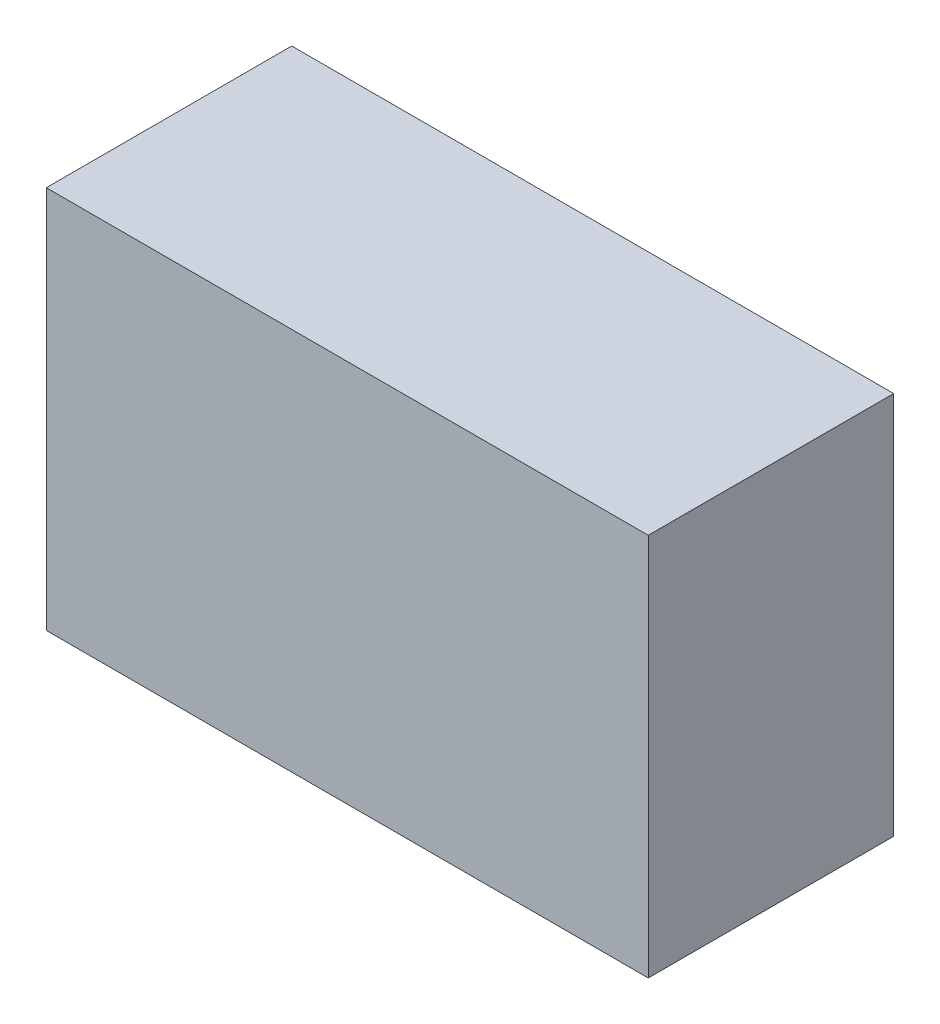
ISO-10303-21;
HEADER;
FILE_DESCRIPTION(('STEP AP214'),'2;1');
FILE_NAME('part.step','',(''),(''),'','','');
FILE_SCHEMA(('AUTOMOTIVE_DESIGN { 1 0 10303 214 1 1 1 1 }'));
ENDSEC;
DATA;
#1=APPLICATION_CONTEXT('core data for automotive mechanical design processes');
#2=APPLICATION_PROTOCOL_DEFINITION('international standard','automotive_design',2000,#1);
#3=PRODUCT_CONTEXT('',#1,'mechanical');
#4=PRODUCT('Part','Part','',(#3));
#5=PRODUCT_RELATED_PRODUCT_CATEGORY('part','',(#4));
#6=PRODUCT_DEFINITION_FORMATION('','',#4);
#7=PRODUCT_DEFINITION_CONTEXT('part definition',#1,'design');
#8=PRODUCT_DEFINITION('design','',#6,#7);
#9=PRODUCT_DEFINITION_SHAPE('','',#8);
#10=(LENGTH_UNIT() NAMED_UNIT(*) SI_UNIT(.MILLI.,.METRE.));
#11=(NAMED_UNIT(*) PLANE_ANGLE_UNIT() SI_UNIT($,.RADIAN.));
#12=(NAMED_UNIT(*) SI_UNIT($,.STERADIAN.) SOLID_ANGLE_UNIT());
#13=UNCERTAINTY_MEASURE_WITH_UNIT(LENGTH_MEASURE(1.E-05),#10,'distance_accuracy_value','');
#14=(GEOMETRIC_REPRESENTATION_CONTEXT(3) GLOBAL_UNCERTAINTY_ASSIGNED_CONTEXT((#13)) GLOBAL_UNIT_ASSIGNED_CONTEXT((#10,
#11,#12)) REPRESENTATION_CONTEXT('',''));
#15=CARTESIAN_POINT('',(0.,0.,0.));
#16=DIRECTION('',(0.,0.,1.));
#17=DIRECTION('',(1.,0.,0.));
#18=AXIS2_PLACEMENT_3D('',#15,#16,#17);
#19=CARTESIAN_POINT('',(0.,-19.8376419710467,6.35));
#20=DIRECTION('',(0.,1.,0.));
#21=DIRECTION('',(-1.,0.,0.));
#22=AXIS2_PLACEMENT_3D('',#19,#20,#21);
#23=PLANE('',#22);
#24=CARTESIAN_POINT('',(23.3612811681514,-19.8376419710467,0.));
#25=DIRECTION('',(0.,1.,0.));
#26=DIRECTION('',(-1.,0.,0.));
#27=AXIS2_PLACEMENT_3D('',#24,#25,#26);
#28=ELLIPSE('',#27,3.66617420935412,3.175);
#29=CARTESIAN_POINT('',(19.6951069587973,-19.8376419710467,0.));
#30=VERTEX_POINT('',#29);
#31=EDGE_CURVE('E11',#30,#30,#28,.T.);
#32=ORIENTED_EDGE('',*,*,#31,.T.);
#33=EDGE_LOOP('',(#32));
#34=FACE_BOUND('',#33,.T.);
#35=DIRECTION('',(1.,0.,0.));
#36=VECTOR('',#35,1.);
#37=CARTESIAN_POINT('',(0.,-19.8376419710467,-6.35));
#38=LINE('',#37,#36);
#39=CARTESIAN_POINT('',(0.,-19.8376419710467,-6.35));
#40=VERTEX_POINT('',#39);
#41=CARTESIAN_POINT('',(31.1483748908686,-19.8376419710467,-6.35));
#42=VERTEX_POINT('',#41);
#43=EDGE_CURVE('E110',#40,#42,#38,.T.);
#44=ORIENTED_EDGE('',*,*,#43,.T.);
#45=DIRECTION('',(0.,0.,-1.));
#46=VECTOR('',#45,1.);
#47=CARTESIAN_POINT('',(31.1483748908686,-19.8376419710467,6.35));
#48=LINE('',#47,#46);
#49=CARTESIAN_POINT('',(31.1483748908686,-19.8376419710467,6.35));
#50=VERTEX_POINT('',#49);
#51=EDGE_CURVE('E108',#50,#42,#48,.T.);
#52=ORIENTED_EDGE('',*,*,#51,.F.);
#53=DIRECTION('',(1.,0.,0.));
#54=VECTOR('',#53,1.);
#55=CARTESIAN_POINT('',(0.,-19.8376419710467,6.35));
#56=LINE('',#55,#54);
#57=CARTESIAN_POINT('',(0.,-19.8376419710467,6.35));
#58=VERTEX_POINT('',#57);
#59=EDGE_CURVE('E99',#58,#50,#56,.T.);
#60=ORIENTED_EDGE('',*,*,#59,.F.);
#61=DIRECTION('',(0.,0.,-1.));
#62=VECTOR('',#61,1.);
#63=CARTESIAN_POINT('',(0.,-19.8376419710467,6.35));
#64=LINE('',#63,#62);
#65=EDGE_CURVE('E112',#58,#40,#64,.T.);
#66=ORIENTED_EDGE('',*,*,#65,.T.);
#67=EDGE_LOOP('',(#44,#52,#60,#66));
#68=FACE_BOUND('',#67,.T.);
#69=CARTESIAN_POINT('',(7.78709372271712,-19.8376419710467,0.));
#70=DIRECTION('',(0.,1.,0.));
#71=DIRECTION('',(1.,0.,0.));
#72=AXIS2_PLACEMENT_3D('',#69,#70,#71);
#73=ELLIPSE('',#72,3.66617420935413,3.175);
#74=CARTESIAN_POINT('',(11.4532679320712,-19.8376419710467,0.));
#75=VERTEX_POINT('',#74);
#76=EDGE_CURVE('E54',#75,#75,#73,.F.);
#77=ORIENTED_EDGE('',*,*,#76,.F.);
#78=EDGE_LOOP('',(#77));
#79=FACE_BOUND('',#78,.T.);
#80=ADVANCED_FACE('F44',(#34,#68,#79),#23,.F.);
#81=CARTESIAN_POINT('',(0.,0.,6.35));
#82=DIRECTION('',(1.,0.,0.));
#83=DIRECTION('',(0.,1.,0.));
#84=AXIS2_PLACEMENT_3D('',#81,#82,#83);
#85=PLANE('',#84);
#86=CARTESIAN_POINT('',(0.,-6.35,0.));
#87=DIRECTION('',(-1.,0.,0.));
#88=DIRECTION('',(0.,-1.,0.));
#89=AXIS2_PLACEMENT_3D('',#86,#87,#88);
#90=CIRCLE('',#89,3.175);
#91=CARTESIAN_POINT('',(0.,-9.525,0.));
#92=VERTEX_POINT('',#91);
#93=EDGE_CURVE('E214',#92,#92,#90,.T.);
#94=ORIENTED_EDGE('',*,*,#93,.F.);
#95=EDGE_LOOP('',(#94));
#96=FACE_BOUND('',#95,.T.);
#97=DIRECTION('',(0.,-1.,0.));
#98=VECTOR('',#97,1.);
#99=CARTESIAN_POINT('',(0.,0.,-6.35));
#100=LINE('',#99,#98);
#101=CARTESIAN_POINT('',(0.,0.,-6.35));
#102=VERTEX_POINT('',#101);
#103=EDGE_CURVE('E124',#102,#40,#100,.T.);
#104=ORIENTED_EDGE('',*,*,#103,.T.);
#105=ORIENTED_EDGE('',*,*,#65,.F.);
#106=DIRECTION('',(0.,-1.,0.));
#107=VECTOR('',#106,1.);
#108=CARTESIAN_POINT('',(0.,0.,6.35));
#109=LINE('',#108,#107);
#110=CARTESIAN_POINT('',(0.,0.,6.35));
#111=VERTEX_POINT('',#110);
#112=EDGE_CURVE('E104',#111,#58,#109,.T.);
#113=ORIENTED_EDGE('',*,*,#112,.F.);
#114=DIRECTION('',(0.,0.,-1.));
#115=VECTOR('',#114,1.);
#116=CARTESIAN_POINT('',(0.,0.,6.35));
#117=LINE('',#116,#115);
#118=EDGE_CURVE('E120',#111,#102,#117,.T.);
#119=ORIENTED_EDGE('',*,*,#118,.T.);
#120=EDGE_LOOP('',(#104,#105,#113,#119));
#121=FACE_BOUND('',#120,.T.);
#122=ADVANCED_FACE('F46',(#96,#121),#85,.F.);
#123=CARTESIAN_POINT('',(31.1483748908686,0.,6.35));
#124=DIRECTION('',(-1.,0.,0.));
#125=DIRECTION('',(0.,-1.,0.));
#126=AXIS2_PLACEMENT_3D('',#123,#124,#125);
#127=PLANE('',#126);
#128=DIRECTION('',(0.,1.,0.));
#129=VECTOR('',#128,1.);
#130=CARTESIAN_POINT('',(31.1483748908686,0.,-6.35));
#131=LINE('',#130,#129);
#132=CARTESIAN_POINT('',(31.1483748908686,0.,-6.35));
#133=VERTEX_POINT('',#132);
#134=EDGE_CURVE('E84',#42,#133,#131,.T.);
#135=ORIENTED_EDGE('',*,*,#134,.T.);
#136=DIRECTION('',(0.,0.,-1.));
#137=VECTOR('',#136,1.);
#138=CARTESIAN_POINT('',(31.1483748908686,0.,6.35));
#139=LINE('',#138,#137);
#140=CARTESIAN_POINT('',(31.1483748908686,0.,6.35));
#141=VERTEX_POINT('',#140);
#142=EDGE_CURVE('E113',#141,#133,#139,.T.);
#143=ORIENTED_EDGE('',*,*,#142,.F.);
#144=DIRECTION('',(0.,1.,0.));
#145=VECTOR('',#144,1.);
#146=CARTESIAN_POINT('',(31.1483748908686,0.,6.35));
#147=LINE('',#146,#145);
#148=EDGE_CURVE('E102',#50,#141,#147,.T.);
#149=ORIENTED_EDGE('',*,*,#148,.F.);
#150=ORIENTED_EDGE('',*,*,#51,.T.);
#151=EDGE_LOOP('',(#135,#143,#149,#150));
#152=FACE_BOUND('',#151,.T.);
#153=ADVANCED_FACE('F115',(#152),#127,.F.);
#154=CARTESIAN_POINT('',(0.,0.,6.35));
#155=DIRECTION('',(0.,-1.,0.));
#156=DIRECTION('',(1.,0.,0.));
#157=AXIS2_PLACEMENT_3D('',#154,#155,#156);
#158=PLANE('',#157);
#159=DIRECTION('',(-1.,0.,0.));
#160=VECTOR('',#159,1.);
#161=CARTESIAN_POINT('',(0.,0.,-6.35));
#162=LINE('',#161,#160);
#163=EDGE_CURVE('E90',#133,#102,#162,.T.);
#164=ORIENTED_EDGE('',*,*,#163,.T.);
#165=ORIENTED_EDGE('',*,*,#118,.F.);
#166=DIRECTION('',(-1.,0.,0.));
#167=VECTOR('',#166,1.);
#168=CARTESIAN_POINT('',(0.,0.,6.35));
#169=LINE('',#168,#167);
#170=EDGE_CURVE('E64',#141,#111,#169,.T.);
#171=ORIENTED_EDGE('',*,*,#170,.F.);
#172=ORIENTED_EDGE('',*,*,#142,.T.);
#173=EDGE_LOOP('',(#164,#165,#171,#172));
#174=FACE_BOUND('',#173,.T.);
#175=ADVANCED_FACE('F154',(#174),#158,.F.);
#176=CARTESIAN_POINT('',(0.,0.,6.35));
#177=DIRECTION('',(0.,0.,1.));
#178=DIRECTION('',(1.,0.,0.));
#179=AXIS2_PLACEMENT_3D('',#176,#177,#178);
#180=PLANE('',#179);
#181=ORIENTED_EDGE('',*,*,#112,.T.);
#182=ORIENTED_EDGE('',*,*,#59,.T.);
#183=ORIENTED_EDGE('',*,*,#148,.T.);
#184=ORIENTED_EDGE('',*,*,#170,.T.);
#185=EDGE_LOOP('',(#181,#182,#183,#184));
#186=FACE_BOUND('',#185,.T.);
#187=ADVANCED_FACE('F100',(#186),#180,.T.);
#188=CARTESIAN_POINT('',(0.,0.,-6.35));
#189=DIRECTION('',(0.,0.,1.));
#190=DIRECTION('',(1.,0.,0.));
#191=AXIS2_PLACEMENT_3D('',#188,#189,#190);
#192=PLANE('',#191);
#193=CARTESIAN_POINT('',(15.5741874454343,-6.35,-6.35));
#194=DIRECTION('',(0.,0.,-1.));
#195=DIRECTION('',(-1.,0.,0.));
#196=AXIS2_PLACEMENT_3D('',#193,#194,#195);
#197=CIRCLE('',#196,3.175);
#198=CARTESIAN_POINT('',(12.3991874454343,-6.35,-6.35));
#199=VERTEX_POINT('',#198);
#200=EDGE_CURVE('E199',#199,#199,#197,.T.);
#201=ORIENTED_EDGE('',*,*,#200,.F.);
#202=EDGE_LOOP('',(#201));
#203=FACE_BOUND('',#202,.T.);
#204=ORIENTED_EDGE('',*,*,#103,.F.);
#205=ORIENTED_EDGE('',*,*,#163,.F.);
#206=ORIENTED_EDGE('',*,*,#134,.F.);
#207=ORIENTED_EDGE('',*,*,#43,.F.);
#208=EDGE_LOOP('',(#204,#205,#206,#207));
#209=FACE_BOUND('',#208,.T.);
#210=ADVANCED_FACE('F157',(#203,#209),#192,.F.);
#211=CARTESIAN_POINT('',(9.525,-6.35,0.));
#212=DIRECTION('',(-1.,0.,0.));
#213=DIRECTION('',(0.,-1.,0.));
#214=AXIS2_PLACEMENT_3D('',#211,#212,#213);
#215=CYLINDRICAL_SURFACE('',#214,3.175);
#216=CARTESIAN_POINT('',(9.525,-6.35,0.));
#217=DIRECTION('',(-1.,0.,0.));
#218=DIRECTION('',(0.,-1.,0.));
#219=AXIS2_PLACEMENT_3D('',#216,#217,#218);
#220=CIRCLE('',#219,3.175);
#221=CARTESIAN_POINT('',(9.525,-9.525,0.));
#222=VERTEX_POINT('',#221);
#223=EDGE_CURVE('E128',#222,#222,#220,.T.);
#224=CARTESIAN_POINT('',(9.525,-9.525,0.));
#225=CARTESIAN_POINT('',(9.42578125,-9.525,0.));
#226=CARTESIAN_POINT('',(9.3265625,-9.525,0.));
#227=CARTESIAN_POINT('',(9.128125,-9.525,0.));
#228=CARTESIAN_POINT('',(9.02890625,-9.525,0.));
#229=CARTESIAN_POINT('',(8.83046875,-9.525,0.));
#230=CARTESIAN_POINT('',(8.73125,-9.525,0.));
#231=CARTESIAN_POINT('',(8.5328125,-9.525,0.));
#232=CARTESIAN_POINT('',(8.43359375,-9.525,0.));
#233=CARTESIAN_POINT('',(8.23515625,-9.525,0.));
#234=CARTESIAN_POINT('',(8.1359375,-9.525,0.));
#235=CARTESIAN_POINT('',(7.9375,-9.525,0.));
#236=CARTESIAN_POINT('',(7.83828125,-9.525,0.));
#237=CARTESIAN_POINT('',(7.63984375,-9.525,0.));
#238=CARTESIAN_POINT('',(7.540625,-9.525,0.));
#239=CARTESIAN_POINT('',(7.3421875,-9.525,0.));
#240=CARTESIAN_POINT('',(7.24296875,-9.525,0.));
#241=CARTESIAN_POINT('',(7.04453125,-9.525,0.));
#242=CARTESIAN_POINT('',(6.9453125,-9.525,0.));
#243=CARTESIAN_POINT('',(6.746875,-9.525,0.));
#244=CARTESIAN_POINT('',(6.64765625,-9.525,0.));
#245=CARTESIAN_POINT('',(6.44921875,-9.525,0.));
#246=CARTESIAN_POINT('',(6.35,-9.525,0.));
#247=CARTESIAN_POINT('',(6.1515625,-9.525,0.));
#248=CARTESIAN_POINT('',(6.05234375,-9.525,0.));
#249=CARTESIAN_POINT('',(5.85390625,-9.525,0.));
#250=CARTESIAN_POINT('',(5.7546875,-9.525,0.));
#251=CARTESIAN_POINT('',(5.55625,-9.525,0.));
#252=CARTESIAN_POINT('',(5.45703125,-9.525,0.));
#253=CARTESIAN_POINT('',(5.25859375,-9.525,0.));
#254=CARTESIAN_POINT('',(5.159375,-9.525,0.));
#255=CARTESIAN_POINT('',(4.9609375,-9.525,0.));
#256=CARTESIAN_POINT('',(4.86171875,-9.525,0.));
#257=CARTESIAN_POINT('',(4.66328125,-9.525,0.));
#258=CARTESIAN_POINT('',(4.5640625,-9.525,0.));
#259=CARTESIAN_POINT('',(4.365625,-9.525,0.));
#260=CARTESIAN_POINT('',(4.26640625,-9.525,0.));
#261=CARTESIAN_POINT('',(4.06796875,-9.525,0.));
#262=CARTESIAN_POINT('',(3.96875,-9.525,0.));
#263=CARTESIAN_POINT('',(3.7703125,-9.525,0.));
#264=CARTESIAN_POINT('',(3.67109375,-9.525,0.));
#265=CARTESIAN_POINT('',(3.47265625,-9.525,0.));
#266=CARTESIAN_POINT('',(3.3734375,-9.525,0.));
#267=CARTESIAN_POINT('',(3.175,-9.525,0.));
#268=CARTESIAN_POINT('',(3.07578125,-9.525,0.));
#269=CARTESIAN_POINT('',(2.87734375,-9.525,0.));
#270=CARTESIAN_POINT('',(2.778125,-9.525,0.));
#271=CARTESIAN_POINT('',(2.5796875,-9.525,0.));
#272=CARTESIAN_POINT('',(2.48046875,-9.525,0.));
#273=CARTESIAN_POINT('',(2.28203125,-9.525,0.));
#274=CARTESIAN_POINT('',(2.1828125,-9.525,0.));
#275=CARTESIAN_POINT('',(1.984375,-9.525,0.));
#276=CARTESIAN_POINT('',(1.88515625,-9.525,0.));
#277=CARTESIAN_POINT('',(1.68671875,-9.525,0.));
#278=CARTESIAN_POINT('',(1.5875,-9.525,0.));
#279=CARTESIAN_POINT('',(1.3890625,-9.525,0.));
#280=CARTESIAN_POINT('',(1.28984375,-9.525,0.));
#281=CARTESIAN_POINT('',(1.09140625,-9.525,0.));
#282=CARTESIAN_POINT('',(0.992187500000001,-9.525,0.));
#283=CARTESIAN_POINT('',(0.793750000000001,-9.525,0.));
#284=CARTESIAN_POINT('',(0.69453125,-9.525,0.));
#285=CARTESIAN_POINT('',(0.49609375,-9.525,0.));
#286=CARTESIAN_POINT('',(0.396875,-9.525,0.));
#287=CARTESIAN_POINT('',(0.1984375,-9.525,0.));
#288=CARTESIAN_POINT('',(0.0992187500000001,-9.525,0.));
#289=CARTESIAN_POINT('',(0.,-9.525,0.));
#290=B_SPLINE_CURVE_WITH_KNOTS('',3,(#224,#225,#226,#227,#228,#229,#230,#231,#232,#233,#234,
#235,#236,#237,#238,#239,#240,#241,#242,#243,#244,#245,#246,#247,#248,#249,#250,#251,#252,#253,
#254,#255,#256,#257,#258,#259,#260,#261,#262,#263,#264,#265,#266,#267,#268,#269,#270,#271,#272,
#273,#274,#275,#276,#277,#278,#279,#280,#281,#282,#283,#284,#285,#286,#287,#288,#289),
.UNSPECIFIED.,.F.,.F.,(4,2,2,2,2,2,2,2,2,2,2,2,2,2,2,2,2,2,2,2,2,2,2,2,2,2,2,2,2,2,2,2,4),(0.,
0.297656249999998,0.595312499999999,0.892968749999999,1.190625,1.48828125,1.7859375,2.08359375,
2.38125,2.67890625,2.9765625,3.27421875,3.571875,3.86953125,4.1671875,4.46484375,4.7625,
5.06015625,5.3578125,5.65546875,5.953125,6.25078125,6.5484375,6.84609375,7.14375,7.44140625,
7.7390625,8.03671875,8.334375,8.63203125,8.9296875,9.22734375,9.525),.UNSPECIFIED.);
#291=EDGE_CURVE('BSEAM160',#222,#92,#290,.T.);
#292=ORIENTED_EDGE('',*,*,#223,.F.);
#293=ORIENTED_EDGE('',*,*,#93,.T.);
#294=ORIENTED_EDGE('',*,*,#291,.T.);
#295=ORIENTED_EDGE('',*,*,#291,.F.);
#296=EDGE_LOOP('',(#292,#294,#293,#295));
#297=FACE_BOUND('',#296,.T.);
#298=ADVANCED_FACE('F160',(#297),#215,.F.);
#299=CARTESIAN_POINT('',(9.525,-6.35,0.));
#300=DIRECTION('',(-1.,0.,0.));
#301=DIRECTION('',(0.,-1.,0.));
#302=AXIS2_PLACEMENT_3D('',#299,#300,#301);
#303=PLANE('',#302);
#304=ORIENTED_EDGE('',*,*,#223,.T.);
#305=EDGE_LOOP('',(#304));
#306=FACE_BOUND('',#305,.T.);
#307=ADVANCED_FACE('F166',(#306),#303,.T.);
#308=CARTESIAN_POINT('',(5.83963727933594,-23.2107354765103,0.));
#309=DIRECTION('',(0.500000000000001,0.866025403784438,0.));
#310=DIRECTION('',(-0.866025403784438,0.500000000000001,0.));
#311=AXIS2_PLACEMENT_3D('',#308,#309,#310);
#312=CYLINDRICAL_SURFACE('',#311,3.175);
#313=CARTESIAN_POINT('',(12.5495937227171,-11.58875,0.));
#314=DIRECTION('',(-0.500000000000001,-0.866025403784438,0.));
#315=DIRECTION('',(0.866025403784438,-0.500000000000001,0.));
#316=AXIS2_PLACEMENT_3D('',#313,#314,#315);
#317=CIRCLE('',#316,3.175);
#318=CARTESIAN_POINT('',(15.2992243797327,-13.17625,0.));
#319=VERTEX_POINT('',#318);
#320=EDGE_CURVE('E209',#319,#319,#317,.T.);
#321=ORIENTED_EDGE('',*,*,#320,.F.);
#322=EDGE_LOOP('',(#321));
#323=FACE_BOUND('',#322,.T.);
#324=ORIENTED_EDGE('',*,*,#76,.T.);
#325=EDGE_LOOP('',(#324));
#326=FACE_BOUND('',#325,.T.);
#327=ADVANCED_FACE('F144',(#323,#326),#312,.F.);
#328=CARTESIAN_POINT('',(12.5495937227171,-11.58875,0.));
#329=DIRECTION('',(-0.500000000000001,-0.866025403784438,0.));
#330=DIRECTION('',(0.866025403784438,-0.500000000000001,0.));
#331=AXIS2_PLACEMENT_3D('',#328,#329,#330);
#332=PLANE('',#331);
#333=ORIENTED_EDGE('',*,*,#320,.T.);
#334=EDGE_LOOP('',(#333));
#335=FACE_BOUND('',#334,.T.);
#336=ADVANCED_FACE('F173',(#335),#332,.T.);
#337=CARTESIAN_POINT('',(15.5741874454343,-6.35,3.175));
#338=DIRECTION('',(0.,0.,-1.));
#339=DIRECTION('',(-1.,0.,0.));
#340=AXIS2_PLACEMENT_3D('',#337,#338,#339);
#341=CYLINDRICAL_SURFACE('',#340,3.175);
#342=CARTESIAN_POINT('',(15.5741874454343,-6.35,3.175));
#343=DIRECTION('',(0.,0.,-1.));
#344=DIRECTION('',(-1.,0.,0.));
#345=AXIS2_PLACEMENT_3D('',#342,#343,#344);
#346=CIRCLE('',#345,3.175);
#347=CARTESIAN_POINT('',(12.3991874454343,-6.35,3.175));
#348=VERTEX_POINT('',#347);
#349=EDGE_CURVE('E204',#348,#348,#346,.T.);
#350=CARTESIAN_POINT('',(12.3991874454343,-6.35,3.175));
#351=CARTESIAN_POINT('',(12.3991874454343,-6.35,3.07578125));
#352=CARTESIAN_POINT('',(12.3991874454343,-6.35,2.9765625));
#353=CARTESIAN_POINT('',(12.3991874454343,-6.35,2.778125));
#354=CARTESIAN_POINT('',(12.3991874454343,-6.35,2.67890625));
#355=CARTESIAN_POINT('',(12.3991874454343,-6.35,2.48046875));
#356=CARTESIAN_POINT('',(12.3991874454343,-6.35,2.38125));
#357=CARTESIAN_POINT('',(12.3991874454343,-6.35,2.1828125));
#358=CARTESIAN_POINT('',(12.3991874454343,-6.35,2.08359375));
#359=CARTESIAN_POINT('',(12.3991874454343,-6.35,1.88515625));
#360=CARTESIAN_POINT('',(12.3991874454343,-6.35,1.7859375));
#361=CARTESIAN_POINT('',(12.3991874454343,-6.35,1.5875));
#362=CARTESIAN_POINT('',(12.3991874454343,-6.35,1.48828125));
#363=CARTESIAN_POINT('',(12.3991874454343,-6.35,1.28984375));
#364=CARTESIAN_POINT('',(12.3991874454343,-6.35,1.190625));
#365=CARTESIAN_POINT('',(12.3991874454343,-6.35,0.992187500000001));
#366=CARTESIAN_POINT('',(12.3991874454343,-6.35,0.892968750000001));
#367=CARTESIAN_POINT('',(12.3991874454343,-6.35,0.694531250000001));
#368=CARTESIAN_POINT('',(12.3991874454343,-6.35,0.5953125));
#369=CARTESIAN_POINT('',(12.3991874454343,-6.35,0.396875));
#370=CARTESIAN_POINT('',(12.3991874454343,-6.35,0.29765625));
#371=CARTESIAN_POINT('',(12.3991874454343,-6.35,0.0992187500000004));
#372=CARTESIAN_POINT('',(12.3991874454343,-6.35,0.));
#373=CARTESIAN_POINT('',(12.3991874454343,-6.35,-0.1984375));
#374=CARTESIAN_POINT('',(12.3991874454343,-6.35,-0.29765625));
#375=CARTESIAN_POINT('',(12.3991874454343,-6.35,-0.49609375));
#376=CARTESIAN_POINT('',(12.3991874454343,-6.35,-0.5953125));
#377=CARTESIAN_POINT('',(12.3991874454343,-6.35,-0.79375));
#378=CARTESIAN_POINT('',(12.3991874454343,-6.35,-0.892968749999999));
#379=CARTESIAN_POINT('',(12.3991874454343,-6.35,-1.09140625));
#380=CARTESIAN_POINT('',(12.3991874454343,-6.35,-1.190625));
#381=CARTESIAN_POINT('',(12.3991874454343,-6.35,-1.3890625));
#382=CARTESIAN_POINT('',(12.3991874454343,-6.35,-1.48828125));
#383=CARTESIAN_POINT('',(12.3991874454343,-6.35,-1.68671875));
#384=CARTESIAN_POINT('',(12.3991874454343,-6.35,-1.7859375));
#385=CARTESIAN_POINT('',(12.3991874454343,-6.35,-1.984375));
#386=CARTESIAN_POINT('',(12.3991874454343,-6.35,-2.08359375));
#387=CARTESIAN_POINT('',(12.3991874454343,-6.35,-2.28203125));
#388=CARTESIAN_POINT('',(12.3991874454343,-6.35,-2.38125));
#389=CARTESIAN_POINT('',(12.3991874454343,-6.35,-2.5796875));
#390=CARTESIAN_POINT('',(12.3991874454343,-6.35,-2.67890625));
#391=CARTESIAN_POINT('',(12.3991874454343,-6.35,-2.87734375));
#392=CARTESIAN_POINT('',(12.3991874454343,-6.35,-2.9765625));
#393=CARTESIAN_POINT('',(12.3991874454343,-6.35,-3.175));
#394=CARTESIAN_POINT('',(12.3991874454343,-6.35,-3.27421875));
#395=CARTESIAN_POINT('',(12.3991874454343,-6.35,-3.47265625));
#396=CARTESIAN_POINT('',(12.3991874454343,-6.35,-3.571875));
#397=CARTESIAN_POINT('',(12.3991874454343,-6.35,-3.7703125));
#398=CARTESIAN_POINT('',(12.3991874454343,-6.35,-3.86953125));
#399=CARTESIAN_POINT('',(12.3991874454343,-6.35,-4.06796875));
#400=CARTESIAN_POINT('',(12.3991874454343,-6.35,-4.1671875));
#401=CARTESIAN_POINT('',(12.3991874454343,-6.35,-4.365625));
#402=CARTESIAN_POINT('',(12.3991874454343,-6.35,-4.46484375));
#403=CARTESIAN_POINT('',(12.3991874454343,-6.35,-4.66328125));
#404=CARTESIAN_POINT('',(12.3991874454343,-6.35,-4.7625));
#405=CARTESIAN_POINT('',(12.3991874454343,-6.35,-4.9609375));
#406=CARTESIAN_POINT('',(12.3991874454343,-6.35,-5.06015625));
#407=CARTESIAN_POINT('',(12.3991874454343,-6.35,-5.25859375));
#408=CARTESIAN_POINT('',(12.3991874454343,-6.35,-5.3578125));
#409=CARTESIAN_POINT('',(12.3991874454343,-6.35,-5.55625));
#410=CARTESIAN_POINT('',(12.3991874454343,-6.35,-5.65546875));
#411=CARTESIAN_POINT('',(12.3991874454343,-6.35,-5.85390625));
#412=CARTESIAN_POINT('',(12.3991874454343,-6.35,-5.953125));
#413=CARTESIAN_POINT('',(12.3991874454343,-6.35,-6.1515625));
#414=CARTESIAN_POINT('',(12.3991874454343,-6.35,-6.25078125));
#415=CARTESIAN_POINT('',(12.3991874454343,-6.35,-6.35));
#416=B_SPLINE_CURVE_WITH_KNOTS('',3,(#350,#351,#352,#353,#354,#355,#356,#357,#358,#359,#360,
#361,#362,#363,#364,#365,#366,#367,#368,#369,#370,#371,#372,#373,#374,#375,#376,#377,#378,#379,
#380,#381,#382,#383,#384,#385,#386,#387,#388,#389,#390,#391,#392,#393,#394,#395,#396,#397,#398,
#399,#400,#401,#402,#403,#404,#405,#406,#407,#408,#409,#410,#411,#412,#413,#414,#415),
.UNSPECIFIED.,.F.,.F.,(4,2,2,2,2,2,2,2,2,2,2,2,2,2,2,2,2,2,2,2,2,2,2,2,2,2,2,2,2,2,2,2,4),(0.,
0.29765625,0.5953125,0.89296875,1.190625,1.48828125,1.7859375,2.08359375,2.38125,2.67890625,
2.9765625,3.27421875,3.571875,3.86953125,4.1671875,4.46484375,4.7625,5.06015625,5.3578125,
5.65546875,5.953125,6.25078125,6.5484375,6.84609375,7.14375,7.44140625,7.7390625,8.03671875,
8.334375,8.63203125,8.9296875,9.22734375,9.525),.UNSPECIFIED.);
#417=EDGE_CURVE('BSEAM177',#348,#199,#416,.T.);
#418=ORIENTED_EDGE('',*,*,#349,.F.);
#419=ORIENTED_EDGE('',*,*,#200,.T.);
#420=ORIENTED_EDGE('',*,*,#417,.T.);
#421=ORIENTED_EDGE('',*,*,#417,.F.);
#422=EDGE_LOOP('',(#418,#420,#419,#421));
#423=FACE_BOUND('',#422,.T.);
#424=ADVANCED_FACE('F177',(#423),#341,.F.);
#425=CARTESIAN_POINT('',(15.5741874454343,-6.35,3.175));
#426=DIRECTION('',(0.,0.,-1.));
#427=DIRECTION('',(-1.,0.,0.));
#428=AXIS2_PLACEMENT_3D('',#425,#426,#427);
#429=PLANE('',#428);
#430=ORIENTED_EDGE('',*,*,#349,.T.);
#431=EDGE_LOOP('',(#430));
#432=FACE_BOUND('',#431,.T.);
#433=ADVANCED_FACE('F181',(#432),#429,.T.);
#434=CARTESIAN_POINT('',(25.3087376115326,-23.2107354765103,0.));
#435=DIRECTION('',(-0.500000000000001,0.866025403784438,0.));
#436=DIRECTION('',(-0.866025403784438,-0.500000000000001,0.));
#437=AXIS2_PLACEMENT_3D('',#434,#435,#436);
#438=CYLINDRICAL_SURFACE('',#437,3.175);
#439=CARTESIAN_POINT('',(18.5987811681514,-11.58875,0.));
#440=DIRECTION('',(-0.500000000000001,0.866025403784438,0.));
#441=DIRECTION('',(-0.866025403784438,-0.500000000000001,0.));
#442=AXIS2_PLACEMENT_3D('',#439,#440,#441);
#443=CIRCLE('',#442,3.175);
#444=CARTESIAN_POINT('',(15.8491505111358,-13.17625,0.));
#445=VERTEX_POINT('',#444);
#446=EDGE_CURVE('E197',#445,#445,#443,.T.);
#447=ORIENTED_EDGE('',*,*,#446,.T.);
#448=EDGE_LOOP('',(#447));
#449=FACE_BOUND('',#448,.T.);
#450=ORIENTED_EDGE('',*,*,#31,.F.);
#451=EDGE_LOOP('',(#450));
#452=FACE_BOUND('',#451,.T.);
#453=ADVANCED_FACE('F185',(#449,#452),#438,.F.);
#454=CARTESIAN_POINT('',(18.5987811681514,-11.58875,0.));
#455=DIRECTION('',(0.500000000000001,-0.866025403784438,0.));
#456=DIRECTION('',(-0.866025403784438,-0.500000000000001,0.));
#457=AXIS2_PLACEMENT_3D('',#454,#455,#456);
#458=PLANE('',#457);
#459=ORIENTED_EDGE('',*,*,#446,.F.);
#460=EDGE_LOOP('',(#459));
#461=FACE_BOUND('',#460,.T.);
#462=ADVANCED_FACE('F189',(#461),#458,.T.);
#463=CLOSED_SHELL('',(#80,#122,#153,#175,#187,#210,#298,#307,#327,#336,#424,#433,#453,#462));
#464=MANIFOLD_SOLID_BREP('B2',#463);
#465=ADVANCED_BREP_SHAPE_REPRESENTATION('',(#18,#464),#14);
#466=SHAPE_DEFINITION_REPRESENTATION(#9,#465);
ENDSEC;
END-ISO-10303-21;
